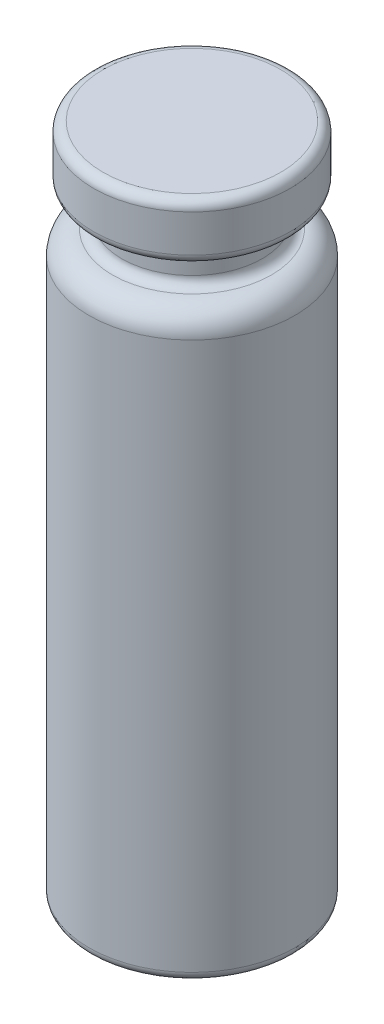
ISO-10303-21;
HEADER;
FILE_DESCRIPTION(('STEP AP214'),'2;1');
FILE_NAME('part.step','',(''),(''),'','','');
FILE_SCHEMA(('AUTOMOTIVE_DESIGN { 1 0 10303 214 1 1 1 1 }'));
ENDSEC;
DATA;
#1=APPLICATION_CONTEXT('core data for automotive mechanical design processes');
#2=APPLICATION_PROTOCOL_DEFINITION('international standard','automotive_design',2000,#1);
#3=PRODUCT_CONTEXT('',#1,'mechanical');
#4=PRODUCT('Part','Part','',(#3));
#5=PRODUCT_RELATED_PRODUCT_CATEGORY('part','',(#4));
#6=PRODUCT_DEFINITION_FORMATION('','',#4);
#7=PRODUCT_DEFINITION_CONTEXT('part definition',#1,'design');
#8=PRODUCT_DEFINITION('design','',#6,#7);
#9=PRODUCT_DEFINITION_SHAPE('','',#8);
#10=(LENGTH_UNIT() NAMED_UNIT(*) SI_UNIT(.MILLI.,.METRE.));
#11=(NAMED_UNIT(*) PLANE_ANGLE_UNIT() SI_UNIT($,.RADIAN.));
#12=(NAMED_UNIT(*) SI_UNIT($,.STERADIAN.) SOLID_ANGLE_UNIT());
#13=UNCERTAINTY_MEASURE_WITH_UNIT(LENGTH_MEASURE(1.E-05),#10,'distance_accuracy_value','');
#14=(GEOMETRIC_REPRESENTATION_CONTEXT(3) GLOBAL_UNCERTAINTY_ASSIGNED_CONTEXT((#13)) GLOBAL_UNIT_ASSIGNED_CONTEXT((#10,
#11,#12)) REPRESENTATION_CONTEXT('',''));
#15=CARTESIAN_POINT('',(0.,0.,0.));
#16=DIRECTION('',(0.,0.,1.));
#17=DIRECTION('',(1.,0.,0.));
#18=AXIS2_PLACEMENT_3D('',#15,#16,#17);
#19=CARTESIAN_POINT('',(0.,62.,0.));
#20=DIRECTION('',(0.,-1.,0.));
#21=DIRECTION('',(0.,0.,-1.));
#22=AXIS2_PLACEMENT_3D('',#19,#20,#21);
#23=CYLINDRICAL_SURFACE('',#22,11.);
#24=CARTESIAN_POINT('',(0.,1.,0.));
#25=DIRECTION('',(0.,1.,0.));
#26=DIRECTION('',(0.,0.,1.));
#27=AXIS2_PLACEMENT_3D('',#24,#25,#26);
#28=CIRCLE('',#27,11.);
#29=CARTESIAN_POINT('',(0.,1.,11.));
#30=VERTEX_POINT('',#29);
#31=EDGE_CURVE('E47',#30,#30,#28,.T.);
#32=ORIENTED_EDGE('',*,*,#31,.T.);
#33=EDGE_LOOP('',(#32));
#34=FACE_BOUND('',#33,.T.);
#35=CARTESIAN_POINT('',(0.,59.5,0.));
#36=DIRECTION('',(0.,1.,0.));
#37=DIRECTION('',(0.,0.,1.));
#38=AXIS2_PLACEMENT_3D('',#35,#36,#37);
#39=CIRCLE('',#38,11.);
#40=CARTESIAN_POINT('',(0.,59.5,11.));
#41=VERTEX_POINT('',#40);
#42=EDGE_CURVE('E83',#41,#41,#39,.F.);
#43=ORIENTED_EDGE('',*,*,#42,.T.);
#44=EDGE_LOOP('',(#43));
#45=FACE_BOUND('',#44,.T.);
#46=ADVANCED_FACE('F39',(#34,#45),#23,.T.);
#47=CARTESIAN_POINT('',(0.,0.,0.));
#48=DIRECTION('',(0.,1.,0.));
#49=DIRECTION('',(0.,0.,1.));
#50=AXIS2_PLACEMENT_3D('',#47,#48,#49);
#51=PLANE('',#50);
#52=CARTESIAN_POINT('',(0.,0.,0.));
#53=DIRECTION('',(0.,1.,0.));
#54=DIRECTION('',(0.,0.,1.));
#55=AXIS2_PLACEMENT_3D('',#52,#53,#54);
#56=CIRCLE('',#55,10.);
#57=CARTESIAN_POINT('',(0.,0.,10.));
#58=VERTEX_POINT('',#57);
#59=EDGE_CURVE('E10',#58,#58,#56,.F.);
#60=ORIENTED_EDGE('',*,*,#59,.T.);
#61=EDGE_LOOP('',(#60));
#62=FACE_BOUND('',#61,.T.);
#63=ADVANCED_FACE('F114',(#62),#51,.F.);
#64=CARTESIAN_POINT('',(0.,66.,0.));
#65=DIRECTION('',(0.,-1.,0.));
#66=DIRECTION('',(0.,0.,-1.));
#67=AXIS2_PLACEMENT_3D('',#64,#65,#66);
#68=CYLINDRICAL_SURFACE('',#67,7.5);
#69=CARTESIAN_POINT('',(0.,65.,0.));
#70=DIRECTION('',(0.,1.,0.));
#71=DIRECTION('',(0.,0.,1.));
#72=AXIS2_PLACEMENT_3D('',#69,#70,#71);
#73=CIRCLE('',#72,7.5);
#74=CARTESIAN_POINT('',(0.,65.,7.5));
#75=VERTEX_POINT('',#74);
#76=EDGE_CURVE('E52',#75,#75,#73,.F.);
#77=ORIENTED_EDGE('',*,*,#76,.T.);
#78=EDGE_LOOP('',(#77));
#79=FACE_BOUND('',#78,.T.);
#80=CARTESIAN_POINT('',(0.,63.,0.));
#81=DIRECTION('',(0.,1.,0.));
#82=DIRECTION('',(0.,0.,1.));
#83=AXIS2_PLACEMENT_3D('',#80,#81,#82);
#84=CIRCLE('',#83,7.5);
#85=CARTESIAN_POINT('',(0.,63.,7.5));
#86=VERTEX_POINT('',#85);
#87=EDGE_CURVE('E57',#86,#86,#84,.T.);
#88=ORIENTED_EDGE('',*,*,#87,.T.);
#89=EDGE_LOOP('',(#88));
#90=FACE_BOUND('',#89,.T.);
#91=ADVANCED_FACE('F118',(#79,#90),#68,.T.);
#92=CARTESIAN_POINT('',(0.,72.,0.));
#93=DIRECTION('',(0.,-1.,0.));
#94=DIRECTION('',(0.,0.,-1.));
#95=AXIS2_PLACEMENT_3D('',#92,#93,#94);
#96=CYLINDRICAL_SURFACE('',#95,10.5);
#97=CARTESIAN_POINT('',(0.,71.,0.));
#98=DIRECTION('',(0.,1.,0.));
#99=DIRECTION('',(0.,0.,1.));
#100=AXIS2_PLACEMENT_3D('',#97,#98,#99);
#101=CIRCLE('',#100,10.5);
#102=CARTESIAN_POINT('',(0.,71.,10.5));
#103=VERTEX_POINT('',#102);
#104=EDGE_CURVE('E71',#103,#103,#101,.F.);
#105=ORIENTED_EDGE('',*,*,#104,.T.);
#106=EDGE_LOOP('',(#105));
#107=FACE_BOUND('',#106,.T.);
#108=CARTESIAN_POINT('',(0.,67.,0.));
#109=DIRECTION('',(0.,1.,0.));
#110=DIRECTION('',(0.,0.,1.));
#111=AXIS2_PLACEMENT_3D('',#108,#109,#110);
#112=CIRCLE('',#111,10.5);
#113=CARTESIAN_POINT('',(0.,67.,10.5));
#114=VERTEX_POINT('',#113);
#115=EDGE_CURVE('E75',#114,#114,#112,.T.);
#116=ORIENTED_EDGE('',*,*,#115,.T.);
#117=EDGE_LOOP('',(#116));
#118=FACE_BOUND('',#117,.T.);
#119=ADVANCED_FACE('F124',(#107,#118),#96,.T.);
#120=CARTESIAN_POINT('',(0.,72.,0.));
#121=DIRECTION('',(0.,1.,0.));
#122=DIRECTION('',(0.,0.,1.));
#123=AXIS2_PLACEMENT_3D('',#120,#121,#122);
#124=PLANE('',#123);
#125=CARTESIAN_POINT('',(0.,72.,0.));
#126=DIRECTION('',(0.,1.,0.));
#127=DIRECTION('',(0.,0.,1.));
#128=AXIS2_PLACEMENT_3D('',#125,#126,#127);
#129=CIRCLE('',#128,9.5);
#130=CARTESIAN_POINT('',(0.,72.,9.5));
#131=VERTEX_POINT('',#130);
#132=EDGE_CURVE('E79',#131,#131,#129,.T.);
#133=ORIENTED_EDGE('',*,*,#132,.T.);
#134=EDGE_LOOP('',(#133));
#135=FACE_BOUND('',#134,.T.);
#136=ADVANCED_FACE('F108',(#135),#124,.T.);
#137=CARTESIAN_POINT('',(0.,66.,0.));
#138=DIRECTION('',(0.,1.,0.));
#139=DIRECTION('',(0.,0.,1.));
#140=AXIS2_PLACEMENT_3D('',#137,#138,#139);
#141=PLANE('',#140);
#142=CARTESIAN_POINT('',(0.,66.,0.));
#143=DIRECTION('',(0.,1.,0.));
#144=DIRECTION('',(0.,0.,1.));
#145=AXIS2_PLACEMENT_3D('',#142,#143,#144);
#146=CIRCLE('',#145,9.5);
#147=CARTESIAN_POINT('',(0.,66.,9.5));
#148=VERTEX_POINT('',#147);
#149=EDGE_CURVE('E63',#148,#148,#146,.F.);
#150=ORIENTED_EDGE('',*,*,#149,.T.);
#151=EDGE_LOOP('',(#150));
#152=FACE_BOUND('',#151,.T.);
#153=CARTESIAN_POINT('',(0.,66.,0.));
#154=DIRECTION('',(0.,1.,0.));
#155=DIRECTION('',(0.,0.,1.));
#156=AXIS2_PLACEMENT_3D('',#153,#154,#155);
#157=CIRCLE('',#156,8.5);
#158=CARTESIAN_POINT('',(0.,66.,8.5));
#159=VERTEX_POINT('',#158);
#160=EDGE_CURVE('E67',#159,#159,#157,.T.);
#161=ORIENTED_EDGE('',*,*,#160,.T.);
#162=EDGE_LOOP('',(#161));
#163=FACE_BOUND('',#162,.T.);
#164=ADVANCED_FACE('F98',(#152,#163),#141,.F.);
#165=CARTESIAN_POINT('',(0.,59.5,0.));
#166=DIRECTION('',(0.,1.,0.));
#167=DIRECTION('',(0.,0.,1.));
#168=AXIS2_PLACEMENT_3D('',#165,#166,#167);
#169=TOROIDAL_SURFACE('',#168,8.5,2.5);
#170=ORIENTED_EDGE('',*,*,#42,.F.);
#171=EDGE_LOOP('',(#170));
#172=FACE_BOUND('',#171,.T.);
#173=CARTESIAN_POINT('',(0.,62.,0.));
#174=DIRECTION('',(0.,1.,0.));
#175=DIRECTION('',(0.,0.,1.));
#176=AXIS2_PLACEMENT_3D('',#173,#174,#175);
#177=CIRCLE('',#176,8.5);
#178=CARTESIAN_POINT('',(0.,62.,8.5));
#179=VERTEX_POINT('',#178);
#180=EDGE_CURVE('E87',#179,#179,#177,.T.);
#181=ORIENTED_EDGE('',*,*,#180,.F.);
#182=EDGE_LOOP('',(#181));
#183=FACE_BOUND('',#182,.T.);
#184=ADVANCED_FACE('F95',(#172,#183),#169,.T.);
#185=CARTESIAN_POINT('',(0.,71.,0.));
#186=DIRECTION('',(0.,1.,0.));
#187=DIRECTION('',(0.,0.,1.));
#188=AXIS2_PLACEMENT_3D('',#185,#186,#187);
#189=TOROIDAL_SURFACE('',#188,9.5,1.);
#190=ORIENTED_EDGE('',*,*,#104,.F.);
#191=EDGE_LOOP('',(#190));
#192=FACE_BOUND('',#191,.T.);
#193=ORIENTED_EDGE('',*,*,#132,.F.);
#194=EDGE_LOOP('',(#193));
#195=FACE_BOUND('',#194,.T.);
#196=ADVANCED_FACE('F97',(#192,#195),#189,.T.);
#197=CARTESIAN_POINT('',(0.,67.,0.));
#198=DIRECTION('',(0.,1.,0.));
#199=DIRECTION('',(0.,0.,1.));
#200=AXIS2_PLACEMENT_3D('',#197,#198,#199);
#201=TOROIDAL_SURFACE('',#200,9.5,1.);
#202=ORIENTED_EDGE('',*,*,#149,.F.);
#203=EDGE_LOOP('',(#202));
#204=FACE_BOUND('',#203,.T.);
#205=ORIENTED_EDGE('',*,*,#115,.F.);
#206=EDGE_LOOP('',(#205));
#207=FACE_BOUND('',#206,.T.);
#208=ADVANCED_FACE('F105',(#204,#207),#201,.T.);
#209=CARTESIAN_POINT('',(0.,65.,0.));
#210=DIRECTION('',(0.,1.,0.));
#211=DIRECTION('',(0.,0.,1.));
#212=AXIS2_PLACEMENT_3D('',#209,#210,#211);
#213=TOROIDAL_SURFACE('',#212,8.5,1.);
#214=ORIENTED_EDGE('',*,*,#76,.F.);
#215=EDGE_LOOP('',(#214));
#216=FACE_BOUND('',#215,.T.);
#217=ORIENTED_EDGE('',*,*,#160,.F.);
#218=EDGE_LOOP('',(#217));
#219=FACE_BOUND('',#218,.T.);
#220=ADVANCED_FACE('F160',(#216,#219),#213,.F.);
#221=CARTESIAN_POINT('',(0.,63.,0.));
#222=DIRECTION('',(0.,1.,0.));
#223=DIRECTION('',(0.,0.,1.));
#224=AXIS2_PLACEMENT_3D('',#221,#222,#223);
#225=TOROIDAL_SURFACE('',#224,8.5,1.);
#226=ORIENTED_EDGE('',*,*,#180,.T.);
#227=EDGE_LOOP('',(#226));
#228=FACE_BOUND('',#227,.T.);
#229=ORIENTED_EDGE('',*,*,#87,.F.);
#230=EDGE_LOOP('',(#229));
#231=FACE_BOUND('',#230,.T.);
#232=ADVANCED_FACE('F92',(#228,#231),#225,.F.);
#233=CARTESIAN_POINT('',(0.,1.,0.));
#234=DIRECTION('',(0.,1.,0.));
#235=DIRECTION('',(0.,0.,1.));
#236=AXIS2_PLACEMENT_3D('',#233,#234,#235);
#237=TOROIDAL_SURFACE('',#236,10.,1.);
#238=ORIENTED_EDGE('',*,*,#59,.F.);
#239=EDGE_LOOP('',(#238));
#240=FACE_BOUND('',#239,.T.);
#241=ORIENTED_EDGE('',*,*,#31,.F.);
#242=EDGE_LOOP('',(#241));
#243=FACE_BOUND('',#242,.T.);
#244=ADVANCED_FACE('F41',(#240,#243),#237,.T.);
#245=CLOSED_SHELL('',(#46,#63,#91,#119,#136,#164,#184,#196,#208,#220,#232,#244));
#246=MANIFOLD_SOLID_BREP('B2',#245);
#247=ADVANCED_BREP_SHAPE_REPRESENTATION('',(#18,#246),#14);
#248=SHAPE_DEFINITION_REPRESENTATION(#9,#247);
ENDSEC;
END-ISO-10303-21;
